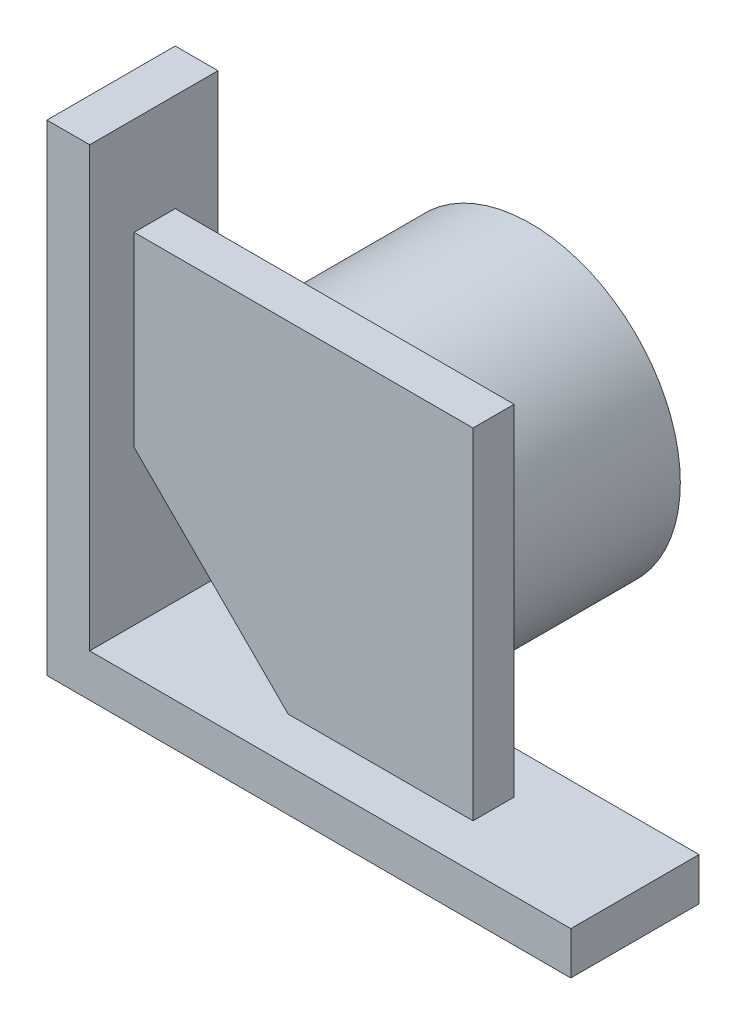
ISO-10303-21;
HEADER;
FILE_DESCRIPTION(('STEP AP214'),'2;1');
FILE_NAME('part.step','',(''),(''),'','','');
FILE_SCHEMA(('AUTOMOTIVE_DESIGN { 1 0 10303 214 1 1 1 1 }'));
ENDSEC;
DATA;
#1=APPLICATION_CONTEXT('core data for automotive mechanical design processes');
#2=APPLICATION_PROTOCOL_DEFINITION('international standard','automotive_design',2000,#1);
#3=PRODUCT_CONTEXT('',#1,'mechanical');
#4=PRODUCT('Part','Part','',(#3));
#5=PRODUCT_RELATED_PRODUCT_CATEGORY('part','',(#4));
#6=PRODUCT_DEFINITION_FORMATION('','',#4);
#7=PRODUCT_DEFINITION_CONTEXT('part definition',#1,'design');
#8=PRODUCT_DEFINITION('design','',#6,#7);
#9=PRODUCT_DEFINITION_SHAPE('','',#8);
#10=(LENGTH_UNIT() NAMED_UNIT(*) SI_UNIT(.MILLI.,.METRE.));
#11=(NAMED_UNIT(*) PLANE_ANGLE_UNIT() SI_UNIT($,.RADIAN.));
#12=(NAMED_UNIT(*) SI_UNIT($,.STERADIAN.) SOLID_ANGLE_UNIT());
#13=UNCERTAINTY_MEASURE_WITH_UNIT(LENGTH_MEASURE(1.E-05),#10,'distance_accuracy_value','');
#14=(GEOMETRIC_REPRESENTATION_CONTEXT(3) GLOBAL_UNCERTAINTY_ASSIGNED_CONTEXT((#13)) GLOBAL_UNIT_ASSIGNED_CONTEXT((#10,
#11,#12)) REPRESENTATION_CONTEXT('',''));
#15=CARTESIAN_POINT('',(0.,0.,0.));
#16=DIRECTION('',(0.,0.,1.));
#17=DIRECTION('',(1.,0.,0.));
#18=AXIS2_PLACEMENT_3D('',#15,#16,#17);
#19=CARTESIAN_POINT('',(12.7,113.7412,12.7));
#20=DIRECTION('',(0.,0.,1.));
#21=DIRECTION('',(0.,-1.,0.));
#22=AXIS2_PLACEMENT_3D('',#19,#20,#21);
#23=PLANE('',#22);
#24=DIRECTION('',(0.707106781186547,-0.707106781186547,0.));
#25=VECTOR('',#24,1.);
#26=CARTESIAN_POINT('',(12.7,58.42,12.7));
#27=LINE('',#26,#25);
#28=CARTESIAN_POINT('',(18.1050431200762,53.0149568799238,12.7));
#29=VERTEX_POINT('',#28);
#30=CARTESIAN_POINT('',(53.0149568799238,18.1050431200762,12.7));
#31=VERTEX_POINT('',#30);
#32=EDGE_CURVE('E150',#29,#31,#27,.T.);
#33=ORIENTED_EDGE('',*,*,#32,.F.);
#34=CARTESIAN_POINT('',(57.2008,57.2008,12.7));
#35=DIRECTION('',(0.,0.,1.));
#36=DIRECTION('',(0.,-1.,0.));
#37=AXIS2_PLACEMENT_3D('',#34,#35,#36);
#38=CIRCLE('',#37,39.3192);
#39=EDGE_CURVE('E136',#31,#29,#38,.T.);
#40=ORIENTED_EDGE('',*,*,#39,.F.);
#41=EDGE_LOOP('',(#33,#40));
#42=FACE_BOUND('',#41,.T.);
#43=ADVANCED_FACE('F38',(#42),#23,.F.);
#44=CARTESIAN_POINT('',(155.575,12.7,0.));
#45=DIRECTION('',(0.,1.,0.));
#46=DIRECTION('',(0.,0.,1.));
#47=AXIS2_PLACEMENT_3D('',#44,#45,#46);
#48=PLANE('',#47);
#49=DIRECTION('',(1.,0.,0.));
#50=VECTOR('',#49,1.);
#51=CARTESIAN_POINT('',(12.7,12.7,24.892));
#52=LINE('',#51,#50);
#53=CARTESIAN_POINT('',(58.42,12.7,24.892));
#54=VERTEX_POINT('',#53);
#55=CARTESIAN_POINT('',(113.3348,12.7,24.892));
#56=VERTEX_POINT('',#55);
#57=EDGE_CURVE('E156',#54,#56,#52,.T.);
#58=ORIENTED_EDGE('',*,*,#57,.F.);
#59=DIRECTION('',(0.,0.,1.));
#60=VECTOR('',#59,1.);
#61=CARTESIAN_POINT('',(58.42,12.7,-51.9578440716979));
#62=LINE('',#61,#60);
#63=CARTESIAN_POINT('',(58.42,12.7,12.7));
#64=VERTEX_POINT('',#63);
#65=EDGE_CURVE('E162',#64,#54,#62,.T.);
#66=ORIENTED_EDGE('',*,*,#65,.F.);
#67=DIRECTION('',(-1.,0.,0.));
#68=VECTOR('',#67,1.);
#69=CARTESIAN_POINT('',(12.7,12.7,12.7));
#70=LINE('',#69,#68);
#71=CARTESIAN_POINT('',(113.3348,12.7,12.7));
#72=VERTEX_POINT('',#71);
#73=EDGE_CURVE('E170',#72,#64,#70,.T.);
#74=ORIENTED_EDGE('',*,*,#73,.F.);
#75=DIRECTION('',(0.,0.,-1.));
#76=VECTOR('',#75,1.);
#77=CARTESIAN_POINT('',(113.3348,12.7,12.7));
#78=LINE('',#77,#76);
#79=EDGE_CURVE('E179',#56,#72,#78,.T.);
#80=ORIENTED_EDGE('',*,*,#79,.F.);
#81=EDGE_LOOP('',(#58,#66,#74,#80));
#82=FACE_BOUND('',#81,.T.);
#83=DIRECTION('',(-1.,0.,0.));
#84=VECTOR('',#83,1.);
#85=CARTESIAN_POINT('',(155.575,12.7,0.));
#86=LINE('',#85,#84);
#87=CARTESIAN_POINT('',(155.575,12.7,0.));
#88=VERTEX_POINT('',#87);
#89=CARTESIAN_POINT('',(12.7,12.7,0.));
#90=VERTEX_POINT('',#89);
#91=EDGE_CURVE('E47',#88,#90,#86,.T.);
#92=ORIENTED_EDGE('',*,*,#91,.T.);
#93=DIRECTION('',(0.,0.,-1.));
#94=VECTOR('',#93,1.);
#95=CARTESIAN_POINT('',(12.7,12.7,0.));
#96=LINE('',#95,#94);
#97=CARTESIAN_POINT('',(12.7,12.7,38.1));
#98=VERTEX_POINT('',#97);
#99=EDGE_CURVE('E194',#98,#90,#96,.T.);
#100=ORIENTED_EDGE('',*,*,#99,.F.);
#101=DIRECTION('',(-1.,0.,0.));
#102=VECTOR('',#101,1.);
#103=CARTESIAN_POINT('',(155.575,12.7,38.1));
#104=LINE('',#103,#102);
#105=CARTESIAN_POINT('',(155.575,12.7,38.1));
#106=VERTEX_POINT('',#105);
#107=EDGE_CURVE('E233',#106,#98,#104,.T.);
#108=ORIENTED_EDGE('',*,*,#107,.F.);
#109=DIRECTION('',(0.,0.,-1.));
#110=VECTOR('',#109,1.);
#111=CARTESIAN_POINT('',(155.575,12.7,0.));
#112=LINE('',#111,#110);
#113=EDGE_CURVE('E220',#106,#88,#112,.T.);
#114=ORIENTED_EDGE('',*,*,#113,.T.);
#115=EDGE_LOOP('',(#92,#100,#108,#114));
#116=FACE_BOUND('',#115,.T.);
#117=ADVANCED_FACE('F260',(#82,#116),#48,.T.);
#118=CARTESIAN_POINT('',(12.7,142.875,0.));
#119=DIRECTION('',(-1.,0.,0.));
#120=DIRECTION('',(0.,0.,1.));
#121=AXIS2_PLACEMENT_3D('',#118,#119,#120);
#122=PLANE('',#121);
#123=ORIENTED_EDGE('',*,*,#99,.T.);
#124=DIRECTION('',(0.,-1.,0.));
#125=VECTOR('',#124,1.);
#126=CARTESIAN_POINT('',(12.7,142.875,0.));
#127=LINE('',#126,#125);
#128=CARTESIAN_POINT('',(12.7,142.875,0.));
#129=VERTEX_POINT('',#128);
#130=EDGE_CURVE('E205',#129,#90,#127,.T.);
#131=ORIENTED_EDGE('',*,*,#130,.F.);
#132=DIRECTION('',(0.,0.,-1.));
#133=VECTOR('',#132,1.);
#134=CARTESIAN_POINT('',(12.7,142.875,0.));
#135=LINE('',#134,#133);
#136=CARTESIAN_POINT('',(12.7,142.875,38.1));
#137=VERTEX_POINT('',#136);
#138=EDGE_CURVE('E200',#137,#129,#135,.T.);
#139=ORIENTED_EDGE('',*,*,#138,.F.);
#140=DIRECTION('',(0.,-1.,0.));
#141=VECTOR('',#140,1.);
#142=CARTESIAN_POINT('',(12.7,142.875,38.1));
#143=LINE('',#142,#141);
#144=EDGE_CURVE('E209',#137,#98,#143,.T.);
#145=ORIENTED_EDGE('',*,*,#144,.T.);
#146=EDGE_LOOP('',(#123,#131,#139,#145));
#147=FACE_BOUND('',#146,.T.);
#148=DIRECTION('',(0.,-1.,0.));
#149=VECTOR('',#148,1.);
#150=CARTESIAN_POINT('',(12.7,113.7412,24.892));
#151=LINE('',#150,#149);
#152=CARTESIAN_POINT('',(12.7,113.7412,24.892));
#153=VERTEX_POINT('',#152);
#154=CARTESIAN_POINT('',(12.7,58.42,24.892));
#155=VERTEX_POINT('',#154);
#156=EDGE_CURVE('E191',#153,#155,#151,.T.);
#157=ORIENTED_EDGE('',*,*,#156,.F.);
#158=DIRECTION('',(0.,0.,1.));
#159=VECTOR('',#158,1.);
#160=CARTESIAN_POINT('',(12.7,113.7412,12.7));
#161=LINE('',#160,#159);
#162=CARTESIAN_POINT('',(12.7,113.7412,12.7));
#163=VERTEX_POINT('',#162);
#164=EDGE_CURVE('E166',#163,#153,#161,.T.);
#165=ORIENTED_EDGE('',*,*,#164,.F.);
#166=DIRECTION('',(0.,-1.,0.));
#167=VECTOR('',#166,1.);
#168=CARTESIAN_POINT('',(12.7,113.7412,12.7));
#169=LINE('',#168,#167);
#170=CARTESIAN_POINT('',(12.7,58.42,12.7));
#171=VERTEX_POINT('',#170);
#172=EDGE_CURVE('E177',#163,#171,#169,.T.);
#173=ORIENTED_EDGE('',*,*,#172,.T.);
#174=DIRECTION('',(0.,0.,1.));
#175=VECTOR('',#174,1.);
#176=CARTESIAN_POINT('',(12.7,58.42,-51.9578440716979));
#177=LINE('',#176,#175);
#178=EDGE_CURVE('E163',#171,#155,#177,.T.);
#179=ORIENTED_EDGE('',*,*,#178,.T.);
#180=EDGE_LOOP('',(#157,#165,#173,#179));
#181=FACE_BOUND('',#180,.T.);
#182=ADVANCED_FACE('F255',(#147,#181),#122,.F.);
#183=CARTESIAN_POINT('',(155.575,0.,0.));
#184=DIRECTION('',(0.,-1.,0.));
#185=DIRECTION('',(0.,0.,-1.));
#186=AXIS2_PLACEMENT_3D('',#183,#184,#185);
#187=PLANE('',#186);
#188=DIRECTION('',(0.,0.,1.));
#189=VECTOR('',#188,1.);
#190=CARTESIAN_POINT('',(0.,0.,0.));
#191=LINE('',#190,#189);
#192=CARTESIAN_POINT('',(0.,0.,0.));
#193=VERTEX_POINT('',#192);
#194=CARTESIAN_POINT('',(0.,0.,38.1));
#195=VERTEX_POINT('',#194);
#196=EDGE_CURVE('E212',#193,#195,#191,.T.);
#197=ORIENTED_EDGE('',*,*,#196,.F.);
#198=DIRECTION('',(-1.,0.,0.));
#199=VECTOR('',#198,1.);
#200=CARTESIAN_POINT('',(155.575,0.,0.));
#201=LINE('',#200,#199);
#202=CARTESIAN_POINT('',(155.575,0.,0.));
#203=VERTEX_POINT('',#202);
#204=EDGE_CURVE('E12',#203,#193,#201,.T.);
#205=ORIENTED_EDGE('',*,*,#204,.F.);
#206=DIRECTION('',(0.,0.,1.));
#207=VECTOR('',#206,1.);
#208=CARTESIAN_POINT('',(155.575,0.,0.));
#209=LINE('',#208,#207);
#210=CARTESIAN_POINT('',(155.575,0.,38.1));
#211=VERTEX_POINT('',#210);
#212=EDGE_CURVE('E213',#203,#211,#209,.T.);
#213=ORIENTED_EDGE('',*,*,#212,.T.);
#214=DIRECTION('',(-1.,0.,0.));
#215=VECTOR('',#214,1.);
#216=CARTESIAN_POINT('',(155.575,0.,38.1));
#217=LINE('',#216,#215);
#218=EDGE_CURVE('E42',#211,#195,#217,.T.);
#219=ORIENTED_EDGE('',*,*,#218,.T.);
#220=EDGE_LOOP('',(#197,#205,#213,#219));
#221=FACE_BOUND('',#220,.T.);
#222=ADVANCED_FACE('F40',(#221),#187,.T.);
#223=CARTESIAN_POINT('',(155.575,0.,0.));
#224=DIRECTION('',(0.,0.,-1.));
#225=DIRECTION('',(-1.,0.,0.));
#226=AXIS2_PLACEMENT_3D('',#223,#224,#225);
#227=PLANE('',#226);
#228=DIRECTION('',(0.,-1.,0.));
#229=VECTOR('',#228,1.);
#230=CARTESIAN_POINT('',(0.,0.,0.));
#231=LINE('',#230,#229);
#232=CARTESIAN_POINT('',(0.,142.875,0.));
#233=VERTEX_POINT('',#232);
#234=EDGE_CURVE('E217',#233,#193,#231,.T.);
#235=ORIENTED_EDGE('',*,*,#234,.F.);
#236=DIRECTION('',(-1.,0.,0.));
#237=VECTOR('',#236,1.);
#238=CARTESIAN_POINT('',(0.,142.875,0.));
#239=LINE('',#238,#237);
#240=EDGE_CURVE('E202',#129,#233,#239,.T.);
#241=ORIENTED_EDGE('',*,*,#240,.F.);
#242=ORIENTED_EDGE('',*,*,#130,.T.);
#243=ORIENTED_EDGE('',*,*,#91,.F.);
#244=DIRECTION('',(0.,-1.,0.));
#245=VECTOR('',#244,1.);
#246=CARTESIAN_POINT('',(155.575,0.,0.));
#247=LINE('',#246,#245);
#248=EDGE_CURVE('E223',#88,#203,#247,.T.);
#249=ORIENTED_EDGE('',*,*,#248,.T.);
#250=ORIENTED_EDGE('',*,*,#204,.T.);
#251=EDGE_LOOP('',(#235,#241,#242,#243,#249,#250));
#252=FACE_BOUND('',#251,.T.);
#253=ADVANCED_FACE('F249',(#252),#227,.T.);
#254=CARTESIAN_POINT('',(155.575,0.,38.1));
#255=DIRECTION('',(0.,0.,1.));
#256=DIRECTION('',(1.,0.,0.));
#257=AXIS2_PLACEMENT_3D('',#254,#255,#256);
#258=PLANE('',#257);
#259=DIRECTION('',(0.,1.,0.));
#260=VECTOR('',#259,1.);
#261=CARTESIAN_POINT('',(0.,0.,38.1));
#262=LINE('',#261,#260);
#263=CARTESIAN_POINT('',(0.,142.875,38.1));
#264=VERTEX_POINT('',#263);
#265=EDGE_CURVE('E228',#195,#264,#262,.T.);
#266=ORIENTED_EDGE('',*,*,#265,.F.);
#267=ORIENTED_EDGE('',*,*,#218,.F.);
#268=DIRECTION('',(0.,1.,0.));
#269=VECTOR('',#268,1.);
#270=CARTESIAN_POINT('',(155.575,0.,38.1));
#271=LINE('',#270,#269);
#272=EDGE_CURVE('E216',#211,#106,#271,.T.);
#273=ORIENTED_EDGE('',*,*,#272,.T.);
#274=ORIENTED_EDGE('',*,*,#107,.T.);
#275=ORIENTED_EDGE('',*,*,#144,.F.);
#276=DIRECTION('',(1.,0.,0.));
#277=VECTOR('',#276,1.);
#278=CARTESIAN_POINT('',(0.,142.875,38.1));
#279=LINE('',#278,#277);
#280=EDGE_CURVE('E198',#264,#137,#279,.T.);
#281=ORIENTED_EDGE('',*,*,#280,.F.);
#282=EDGE_LOOP('',(#266,#267,#273,#274,#275,#281));
#283=FACE_BOUND('',#282,.T.);
#284=ADVANCED_FACE('F243',(#283),#258,.T.);
#285=CARTESIAN_POINT('',(155.575,0.,0.));
#286=DIRECTION('',(-1.,0.,0.));
#287=DIRECTION('',(0.,0.,1.));
#288=AXIS2_PLACEMENT_3D('',#285,#286,#287);
#289=PLANE('',#288);
#290=ORIENTED_EDGE('',*,*,#212,.F.);
#291=ORIENTED_EDGE('',*,*,#248,.F.);
#292=ORIENTED_EDGE('',*,*,#113,.F.);
#293=ORIENTED_EDGE('',*,*,#272,.F.);
#294=EDGE_LOOP('',(#290,#291,#292,#293));
#295=FACE_BOUND('',#294,.T.);
#296=ADVANCED_FACE('F262',(#295),#289,.F.);
#297=CARTESIAN_POINT('',(0.,0.,0.));
#298=DIRECTION('',(-1.,0.,0.));
#299=DIRECTION('',(0.,0.,1.));
#300=AXIS2_PLACEMENT_3D('',#297,#298,#299);
#301=PLANE('',#300);
#302=ORIENTED_EDGE('',*,*,#196,.T.);
#303=ORIENTED_EDGE('',*,*,#265,.T.);
#304=DIRECTION('',(0.,0.,1.));
#305=VECTOR('',#304,1.);
#306=CARTESIAN_POINT('',(0.,142.875,0.));
#307=LINE('',#306,#305);
#308=EDGE_CURVE('E195',#233,#264,#307,.T.);
#309=ORIENTED_EDGE('',*,*,#308,.F.);
#310=ORIENTED_EDGE('',*,*,#234,.T.);
#311=EDGE_LOOP('',(#302,#303,#309,#310));
#312=FACE_BOUND('',#311,.T.);
#313=ADVANCED_FACE('F246',(#312),#301,.T.);
#314=CARTESIAN_POINT('',(0.,142.875,0.));
#315=DIRECTION('',(0.,1.,0.));
#316=DIRECTION('',(0.,0.,1.));
#317=AXIS2_PLACEMENT_3D('',#314,#315,#316);
#318=PLANE('',#317);
#319=ORIENTED_EDGE('',*,*,#308,.T.);
#320=ORIENTED_EDGE('',*,*,#280,.T.);
#321=ORIENTED_EDGE('',*,*,#138,.T.);
#322=ORIENTED_EDGE('',*,*,#240,.T.);
#323=EDGE_LOOP('',(#319,#320,#321,#322));
#324=FACE_BOUND('',#323,.T.);
#325=ADVANCED_FACE('F251',(#324),#318,.T.);
#326=CARTESIAN_POINT('',(12.7,113.7412,24.892));
#327=DIRECTION('',(0.,0.,-1.));
#328=DIRECTION('',(0.,1.,0.));
#329=AXIS2_PLACEMENT_3D('',#326,#327,#328);
#330=PLANE('',#329);
#331=ORIENTED_EDGE('',*,*,#156,.T.);
#332=DIRECTION('',(-0.707106781186547,0.707106781186547,0.));
#333=VECTOR('',#332,1.);
#334=CARTESIAN_POINT('',(12.7,58.42,24.892));
#335=LINE('',#334,#333);
#336=EDGE_CURVE('E159',#54,#155,#335,.T.);
#337=ORIENTED_EDGE('',*,*,#336,.F.);
#338=ORIENTED_EDGE('',*,*,#57,.T.);
#339=DIRECTION('',(0.,-1.,0.));
#340=VECTOR('',#339,1.);
#341=CARTESIAN_POINT('',(113.3348,113.7412,24.892));
#342=LINE('',#341,#340);
#343=CARTESIAN_POINT('',(113.3348,113.7412,24.892));
#344=VERTEX_POINT('',#343);
#345=EDGE_CURVE('E188',#344,#56,#342,.T.);
#346=ORIENTED_EDGE('',*,*,#345,.F.);
#347=DIRECTION('',(1.,0.,0.));
#348=VECTOR('',#347,1.);
#349=CARTESIAN_POINT('',(12.7,113.7412,24.892));
#350=LINE('',#349,#348);
#351=EDGE_CURVE('E169',#153,#344,#350,.T.);
#352=ORIENTED_EDGE('',*,*,#351,.F.);
#353=EDGE_LOOP('',(#331,#337,#338,#346,#352));
#354=FACE_BOUND('',#353,.T.);
#355=ADVANCED_FACE('F290',(#354),#330,.F.);
#356=CARTESIAN_POINT('',(113.3348,113.7412,12.7));
#357=DIRECTION('',(-1.,0.,0.));
#358=DIRECTION('',(0.,0.,1.));
#359=AXIS2_PLACEMENT_3D('',#356,#357,#358);
#360=PLANE('',#359);
#361=ORIENTED_EDGE('',*,*,#79,.T.);
#362=DIRECTION('',(0.,-1.,0.));
#363=VECTOR('',#362,1.);
#364=CARTESIAN_POINT('',(113.3348,113.7412,12.7));
#365=LINE('',#364,#363);
#366=CARTESIAN_POINT('',(113.3348,113.7412,12.7));
#367=VERTEX_POINT('',#366);
#368=EDGE_CURVE('E185',#367,#72,#365,.T.);
#369=ORIENTED_EDGE('',*,*,#368,.F.);
#370=DIRECTION('',(0.,0.,-1.));
#371=VECTOR('',#370,1.);
#372=CARTESIAN_POINT('',(113.3348,113.7412,12.7));
#373=LINE('',#372,#371);
#374=EDGE_CURVE('E172',#344,#367,#373,.T.);
#375=ORIENTED_EDGE('',*,*,#374,.F.);
#376=ORIENTED_EDGE('',*,*,#345,.T.);
#377=EDGE_LOOP('',(#361,#369,#375,#376));
#378=FACE_BOUND('',#377,.T.);
#379=ADVANCED_FACE('F283',(#378),#360,.F.);
#380=CARTESIAN_POINT('',(57.2008,57.2008,12.7));
#381=DIRECTION('',(0.,0.,1.));
#382=DIRECTION('',(0.,-1.,0.));
#383=AXIS2_PLACEMENT_3D('',#380,#381,#382);
#384=CIRCLE('',#383,44.45);
#385=CARTESIAN_POINT('',(58.3542322827508,12.7657677172492,12.7));
#386=VERTEX_POINT('',#385);
#387=CARTESIAN_POINT('',(12.7657677172492,58.3542322827508,12.7));
#388=VERTEX_POINT('',#387);
#389=EDGE_CURVE('E54',#386,#388,#384,.T.);
#390=ORIENTED_EDGE('',*,*,#389,.T.);
#391=EDGE_CURVE('E155',#171,#388,#27,.T.);
#392=ORIENTED_EDGE('',*,*,#391,.F.);
#393=ORIENTED_EDGE('',*,*,#172,.F.);
#394=DIRECTION('',(-1.,0.,0.));
#395=VECTOR('',#394,1.);
#396=CARTESIAN_POINT('',(12.7,113.7412,12.7));
#397=LINE('',#396,#395);
#398=EDGE_CURVE('E174',#367,#163,#397,.T.);
#399=ORIENTED_EDGE('',*,*,#398,.F.);
#400=ORIENTED_EDGE('',*,*,#368,.T.);
#401=ORIENTED_EDGE('',*,*,#73,.T.);
#402=EDGE_CURVE('E62',#386,#64,#27,.T.);
#403=ORIENTED_EDGE('',*,*,#402,.F.);
#404=EDGE_LOOP('',(#390,#392,#393,#399,#400,#401,#403));
#405=FACE_BOUND('',#404,.T.);
#406=ADVANCED_FACE('F273',(#405),#23,.F.);
#407=CARTESIAN_POINT('',(0.,113.7412,0.));
#408=DIRECTION('',(0.,1.,0.));
#409=DIRECTION('',(0.,0.,1.));
#410=AXIS2_PLACEMENT_3D('',#407,#408,#409);
#411=PLANE('',#410);
#412=ORIENTED_EDGE('',*,*,#164,.T.);
#413=ORIENTED_EDGE('',*,*,#351,.T.);
#414=ORIENTED_EDGE('',*,*,#374,.T.);
#415=ORIENTED_EDGE('',*,*,#398,.T.);
#416=EDGE_LOOP('',(#412,#413,#414,#415));
#417=FACE_BOUND('',#416,.T.);
#418=ADVANCED_FACE('F282',(#417),#411,.T.);
#419=CARTESIAN_POINT('',(12.7,58.42,-51.9578440716979));
#420=DIRECTION('',(0.707106781186547,0.707106781186547,0.));
#421=DIRECTION('',(-0.707106781186548,0.707106781186548,0.));
#422=AXIS2_PLACEMENT_3D('',#419,#420,#421);
#423=PLANE('',#422);
#424=ORIENTED_EDGE('',*,*,#391,.T.);
#425=EDGE_CURVE('E147',#388,#29,#27,.T.);
#426=ORIENTED_EDGE('',*,*,#425,.T.);
#427=ORIENTED_EDGE('',*,*,#32,.T.);
#428=EDGE_CURVE('E148',#31,#386,#27,.T.);
#429=ORIENTED_EDGE('',*,*,#428,.T.);
#430=ORIENTED_EDGE('',*,*,#402,.T.);
#431=ORIENTED_EDGE('',*,*,#65,.T.);
#432=ORIENTED_EDGE('',*,*,#336,.T.);
#433=ORIENTED_EDGE('',*,*,#178,.F.);
#434=EDGE_LOOP('',(#424,#426,#427,#429,#430,#431,#432,#433));
#435=FACE_BOUND('',#434,.T.);
#436=ADVANCED_FACE('F153',(#435),#423,.F.);
#437=CARTESIAN_POINT('',(12.7,113.7412,12.7));
#438=DIRECTION('',(0.,0.,1.));
#439=DIRECTION('',(0.,-1.,0.));
#440=AXIS2_PLACEMENT_3D('',#437,#438,#439);
#441=PLANE('',#440);
#442=ORIENTED_EDGE('',*,*,#425,.F.);
#443=EDGE_CURVE('E292',#388,#386,#384,.T.);
#444=ORIENTED_EDGE('',*,*,#443,.T.);
#445=ORIENTED_EDGE('',*,*,#428,.F.);
#446=EDGE_CURVE('E139',#29,#31,#38,.T.);
#447=ORIENTED_EDGE('',*,*,#446,.F.);
#448=EDGE_LOOP('',(#442,#444,#445,#447));
#449=FACE_BOUND('',#448,.T.);
#450=ADVANCED_FACE('F145',(#449),#441,.T.);
#451=CARTESIAN_POINT('',(57.2008,57.2008,138.423585694968));
#452=DIRECTION('',(0.,0.,-1.));
#453=DIRECTION('',(0.,1.,0.));
#454=AXIS2_PLACEMENT_3D('',#451,#452,#453);
#455=CYLINDRICAL_SURFACE('',#454,44.45);
#456=CARTESIAN_POINT('',(57.2008,57.2008,-48.3616));
#457=DIRECTION('',(0.,0.,1.));
#458=DIRECTION('',(1.,0.,0.));
#459=AXIS2_PLACEMENT_3D('',#456,#457,#458);
#460=CIRCLE('',#459,44.45);
#461=CARTESIAN_POINT('',(101.6508,57.2008,-48.3616));
#462=VERTEX_POINT('',#461);
#463=EDGE_CURVE('E294',#462,#462,#460,.T.);
#464=ORIENTED_EDGE('',*,*,#463,.T.);
#465=EDGE_LOOP('',(#464));
#466=FACE_BOUND('',#465,.T.);
#467=ORIENTED_EDGE('',*,*,#389,.F.);
#468=ORIENTED_EDGE('',*,*,#443,.F.);
#469=EDGE_LOOP('',(#467,#468));
#470=FACE_BOUND('',#469,.T.);
#471=ADVANCED_FACE('F300',(#466,#470),#455,.T.);
#472=CARTESIAN_POINT('',(57.2008,57.2008,-48.3616));
#473=DIRECTION('',(0.,0.,1.));
#474=DIRECTION('',(1.,0.,0.));
#475=AXIS2_PLACEMENT_3D('',#472,#473,#474);
#476=PLANE('',#475);
#477=ORIENTED_EDGE('',*,*,#463,.F.);
#478=EDGE_LOOP('',(#477));
#479=FACE_BOUND('',#478,.T.);
#480=CARTESIAN_POINT('',(57.2008,57.2008,-48.3616));
#481=DIRECTION('',(0.,0.,1.));
#482=DIRECTION('',(1.,0.,0.));
#483=AXIS2_PLACEMENT_3D('',#480,#481,#482);
#484=CIRCLE('',#483,39.3192);
#485=CARTESIAN_POINT('',(96.52,57.2008,-48.3616));
#486=VERTEX_POINT('',#485);
#487=EDGE_CURVE('E149',#486,#486,#484,.T.);
#488=ORIENTED_EDGE('',*,*,#487,.T.);
#489=EDGE_LOOP('',(#488));
#490=FACE_BOUND('',#489,.T.);
#491=ADVANCED_FACE('F302',(#479,#490),#476,.F.);
#492=CARTESIAN_POINT('',(57.2008,57.2008,138.423585694968));
#493=DIRECTION('',(0.,0.,-1.));
#494=DIRECTION('',(0.,1.,0.));
#495=AXIS2_PLACEMENT_3D('',#492,#493,#494);
#496=CYLINDRICAL_SURFACE('',#495,39.3192);
#497=ORIENTED_EDGE('',*,*,#487,.F.);
#498=EDGE_LOOP('',(#497));
#499=FACE_BOUND('',#498,.T.);
#500=ORIENTED_EDGE('',*,*,#446,.T.);
#501=ORIENTED_EDGE('',*,*,#39,.T.);
#502=EDGE_LOOP('',(#500,#501));
#503=FACE_BOUND('',#502,.T.);
#504=ADVANCED_FACE('F138',(#499,#503),#496,.F.);
#505=CLOSED_SHELL('',(#43,#117,#182,#222,#253,#284,#296,#313,#325,#355,#379,#406,#418,#436,#450,
#471,#491,#504));
#506=MANIFOLD_SOLID_BREP('B2',#505);
#507=ADVANCED_BREP_SHAPE_REPRESENTATION('',(#18,#506),#14);
#508=SHAPE_DEFINITION_REPRESENTATION(#9,#507);
ENDSEC;
END-ISO-10303-21;
